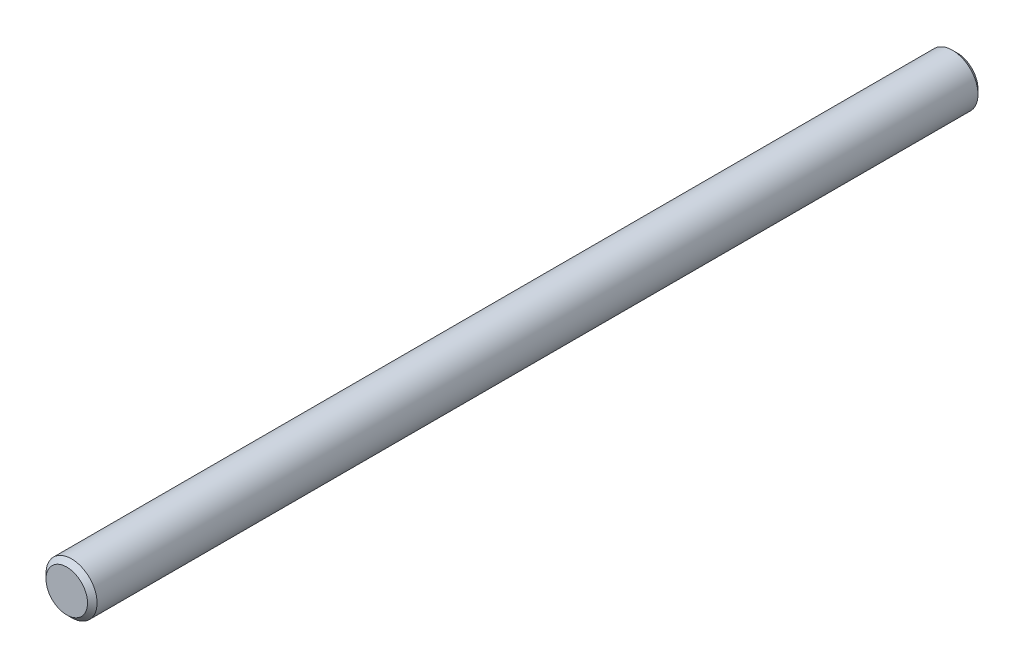
ISO-10303-21;
HEADER;
FILE_DESCRIPTION(('STEP AP214'),'2;1');
FILE_NAME('part.step','',(''),(''),'','','');
FILE_SCHEMA(('AUTOMOTIVE_DESIGN { 1 0 10303 214 1 1 1 1 }'));
ENDSEC;
DATA;
#1=APPLICATION_CONTEXT('core data for automotive mechanical design processes');
#2=APPLICATION_PROTOCOL_DEFINITION('international standard','automotive_design',2000,#1);
#3=PRODUCT_CONTEXT('',#1,'mechanical');
#4=PRODUCT('Part','Part','',(#3));
#5=PRODUCT_RELATED_PRODUCT_CATEGORY('part','',(#4));
#6=PRODUCT_DEFINITION_FORMATION('','',#4);
#7=PRODUCT_DEFINITION_CONTEXT('part definition',#1,'design');
#8=PRODUCT_DEFINITION('design','',#6,#7);
#9=PRODUCT_DEFINITION_SHAPE('','',#8);
#10=(LENGTH_UNIT() NAMED_UNIT(*) SI_UNIT(.MILLI.,.METRE.));
#11=(NAMED_UNIT(*) PLANE_ANGLE_UNIT() SI_UNIT($,.RADIAN.));
#12=(NAMED_UNIT(*) SI_UNIT($,.STERADIAN.) SOLID_ANGLE_UNIT());
#13=UNCERTAINTY_MEASURE_WITH_UNIT(LENGTH_MEASURE(1.E-05),#10,'distance_accuracy_value','');
#14=(GEOMETRIC_REPRESENTATION_CONTEXT(3) GLOBAL_UNCERTAINTY_ASSIGNED_CONTEXT((#13)) GLOBAL_UNIT_ASSIGNED_CONTEXT((#10,
#11,#12)) REPRESENTATION_CONTEXT('',''));
#15=CARTESIAN_POINT('',(0.,0.,0.));
#16=DIRECTION('',(0.,0.,1.));
#17=DIRECTION('',(1.,0.,0.));
#18=AXIS2_PLACEMENT_3D('',#15,#16,#17);
#19=CARTESIAN_POINT('',(0.,0.,-38.1));
#20=DIRECTION('',(0.,0.,1.));
#21=DIRECTION('',(1.,0.,0.));
#22=AXIS2_PLACEMENT_3D('',#19,#20,#21);
#23=CYLINDRICAL_SURFACE('',#22,1.0922);
#24=CARTESIAN_POINT('',(0.,0.,-37.8968));
#25=DIRECTION('',(0.,0.,1.));
#26=DIRECTION('',(1.,0.,0.));
#27=AXIS2_PLACEMENT_3D('',#24,#25,#26);
#28=CIRCLE('',#27,1.0922);
#29=CARTESIAN_POINT('',(1.0922,0.,-37.8968));
#30=VERTEX_POINT('',#29);
#31=EDGE_CURVE('E44',#30,#30,#28,.T.);
#32=CARTESIAN_POINT('',(0.,0.,-0.203199999999994));
#33=DIRECTION('',(0.,0.,1.));
#34=DIRECTION('',(1.,0.,0.));
#35=AXIS2_PLACEMENT_3D('',#32,#33,#34);
#36=CIRCLE('',#35,1.0922);
#37=CARTESIAN_POINT('',(1.0922,0.,-0.203200000000001));
#38=VERTEX_POINT('',#37);
#39=EDGE_CURVE('E48',#38,#38,#36,.F.);
#40=CARTESIAN_POINT('',(1.0922,0.,-37.8968));
#41=CARTESIAN_POINT('',(1.0922,0.,-37.5041583333333));
#42=CARTESIAN_POINT('',(1.0922,0.,-37.1115166666667));
#43=CARTESIAN_POINT('',(1.0922,0.,-36.3262333333333));
#44=CARTESIAN_POINT('',(1.0922,0.,-35.9335916666667));
#45=CARTESIAN_POINT('',(1.0922,0.,-35.1483083333333));
#46=CARTESIAN_POINT('',(1.0922,0.,-34.7556666666667));
#47=CARTESIAN_POINT('',(1.0922,0.,-33.9703833333333));
#48=CARTESIAN_POINT('',(1.0922,0.,-33.5777416666667));
#49=CARTESIAN_POINT('',(1.0922,0.,-32.7924583333333));
#50=CARTESIAN_POINT('',(1.0922,0.,-32.3998166666667));
#51=CARTESIAN_POINT('',(1.0922,0.,-31.6145333333333));
#52=CARTESIAN_POINT('',(1.0922,0.,-31.2218916666667));
#53=CARTESIAN_POINT('',(1.0922,0.,-30.4366083333333));
#54=CARTESIAN_POINT('',(1.0922,0.,-30.0439666666667));
#55=CARTESIAN_POINT('',(1.0922,0.,-29.2586833333333));
#56=CARTESIAN_POINT('',(1.0922,0.,-28.8660416666667));
#57=CARTESIAN_POINT('',(1.0922,0.,-28.0807583333333));
#58=CARTESIAN_POINT('',(1.0922,0.,-27.6881166666667));
#59=CARTESIAN_POINT('',(1.0922,0.,-26.9028333333333));
#60=CARTESIAN_POINT('',(1.0922,0.,-26.5101916666667));
#61=CARTESIAN_POINT('',(1.0922,0.,-25.7249083333333));
#62=CARTESIAN_POINT('',(1.0922,0.,-25.3322666666667));
#63=CARTESIAN_POINT('',(1.0922,0.,-24.5469833333333));
#64=CARTESIAN_POINT('',(1.0922,0.,-24.1543416666667));
#65=CARTESIAN_POINT('',(1.0922,0.,-23.3690583333333));
#66=CARTESIAN_POINT('',(1.0922,0.,-22.9764166666667));
#67=CARTESIAN_POINT('',(1.0922,0.,-22.1911333333333));
#68=CARTESIAN_POINT('',(1.0922,0.,-21.7984916666667));
#69=CARTESIAN_POINT('',(1.0922,0.,-21.0132083333333));
#70=CARTESIAN_POINT('',(1.0922,0.,-20.6205666666667));
#71=CARTESIAN_POINT('',(1.0922,0.,-19.8352833333333));
#72=CARTESIAN_POINT('',(1.0922,0.,-19.4426416666667));
#73=CARTESIAN_POINT('',(1.0922,0.,-18.6573583333333));
#74=CARTESIAN_POINT('',(1.0922,0.,-18.2647166666667));
#75=CARTESIAN_POINT('',(1.0922,0.,-17.4794333333333));
#76=CARTESIAN_POINT('',(1.0922,0.,-17.0867916666667));
#77=CARTESIAN_POINT('',(1.0922,0.,-16.3015083333333));
#78=CARTESIAN_POINT('',(1.0922,0.,-15.9088666666667));
#79=CARTESIAN_POINT('',(1.0922,0.,-15.1235833333333));
#80=CARTESIAN_POINT('',(1.0922,0.,-14.7309416666667));
#81=CARTESIAN_POINT('',(1.0922,0.,-13.9456583333333));
#82=CARTESIAN_POINT('',(1.0922,0.,-13.5530166666667));
#83=CARTESIAN_POINT('',(1.0922,0.,-12.7677333333333));
#84=CARTESIAN_POINT('',(1.0922,0.,-12.3750916666667));
#85=CARTESIAN_POINT('',(1.0922,0.,-11.5898083333333));
#86=CARTESIAN_POINT('',(1.0922,0.,-11.1971666666667));
#87=CARTESIAN_POINT('',(1.0922,0.,-10.4118833333333));
#88=CARTESIAN_POINT('',(1.0922,0.,-10.0192416666667));
#89=CARTESIAN_POINT('',(1.0922,0.,-9.23395833333333));
#90=CARTESIAN_POINT('',(1.0922,0.,-8.84131666666666));
#91=CARTESIAN_POINT('',(1.0922,0.,-8.05603333333333));
#92=CARTESIAN_POINT('',(1.0922,0.,-7.66339166666666));
#93=CARTESIAN_POINT('',(1.0922,0.,-6.87810833333333));
#94=CARTESIAN_POINT('',(1.0922,0.,-6.48546666666666));
#95=CARTESIAN_POINT('',(1.0922,0.,-5.70018333333333));
#96=CARTESIAN_POINT('',(1.0922,0.,-5.30754166666667));
#97=CARTESIAN_POINT('',(1.0922,0.,-4.52225833333333));
#98=CARTESIAN_POINT('',(1.0922,0.,-4.12961666666667));
#99=CARTESIAN_POINT('',(1.0922,0.,-3.34433333333333));
#100=CARTESIAN_POINT('',(1.0922,0.,-2.95169166666666));
#101=CARTESIAN_POINT('',(1.0922,0.,-2.16640833333333));
#102=CARTESIAN_POINT('',(1.0922,0.,-1.77376666666666));
#103=CARTESIAN_POINT('',(1.0922,0.,-0.988483333333331));
#104=CARTESIAN_POINT('',(1.0922,0.,-0.595841666666666));
#105=CARTESIAN_POINT('',(1.0922,0.,-0.203200000000001));
#106=B_SPLINE_CURVE_WITH_KNOTS('',3,(#40,#41,#42,#43,#44,#45,#46,#47,#48,#49,#50,#51,#52,#53,
#54,#55,#56,#57,#58,#59,#60,#61,#62,#63,#64,#65,#66,#67,#68,#69,#70,#71,#72,#73,#74,#75,#76,#77,
#78,#79,#80,#81,#82,#83,#84,#85,#86,#87,#88,#89,#90,#91,#92,#93,#94,#95,#96,#97,#98,#99,#100,
#101,#102,#103,#104,#105),.UNSPECIFIED.,.F.,.F.,(4,2,2,2,2,2,2,2,2,2,2,2,2,2,2,2,2,2,2,2,2,2,2,
2,2,2,2,2,2,2,2,2,4),(0.,1.177925,2.35585000000001,3.533775,4.71170000000001,5.889625,
7.06755000000001,8.245475,9.42340000000001,10.601325,11.77925,12.957175,14.1351,15.313025,
16.49095,17.668875,18.8468,20.024725,21.20265,22.380575,23.5585,24.736425,25.91435,27.092275,
28.2702,29.448125,30.62605,31.803975,32.9819,34.159825,35.33775,36.515675,37.6936),.UNSPECIFIED.);
#107=EDGE_CURVE('BSEAM34',#30,#38,#106,.T.);
#108=ORIENTED_EDGE('',*,*,#31,.T.);
#109=ORIENTED_EDGE('',*,*,#39,.T.);
#110=ORIENTED_EDGE('',*,*,#107,.T.);
#111=ORIENTED_EDGE('',*,*,#107,.F.);
#112=EDGE_LOOP('',(#108,#110,#109,#111));
#113=FACE_BOUND('',#112,.T.);
#114=ADVANCED_FACE('F34',(#113),#23,.T.);
#115=CARTESIAN_POINT('',(0.,0.,-38.1));
#116=DIRECTION('',(0.,0.,1.));
#117=DIRECTION('',(1.,0.,0.));
#118=AXIS2_PLACEMENT_3D('',#115,#116,#117);
#119=PLANE('',#118);
#120=CARTESIAN_POINT('',(0.,0.,-38.1));
#121=DIRECTION('',(0.,0.,1.));
#122=DIRECTION('',(1.,0.,0.));
#123=AXIS2_PLACEMENT_3D('',#120,#121,#122);
#124=CIRCLE('',#123,0.888999999999987);
#125=CARTESIAN_POINT('',(0.888999999999983,0.,-38.1));
#126=VERTEX_POINT('',#125);
#127=EDGE_CURVE('E40',#126,#126,#124,.F.);
#128=ORIENTED_EDGE('',*,*,#127,.T.);
#129=EDGE_LOOP('',(#128));
#130=FACE_BOUND('',#129,.T.);
#131=ADVANCED_FACE('F67',(#130),#119,.F.);
#132=CARTESIAN_POINT('',(0.,0.,0.));
#133=DIRECTION('',(0.,0.,1.));
#134=DIRECTION('',(1.,0.,0.));
#135=AXIS2_PLACEMENT_3D('',#132,#133,#134);
#136=PLANE('',#135);
#137=CARTESIAN_POINT('',(0.,0.,0.));
#138=DIRECTION('',(0.,0.,1.));
#139=DIRECTION('',(1.,0.,0.));
#140=AXIS2_PLACEMENT_3D('',#137,#138,#139);
#141=CIRCLE('',#140,0.889000000000001);
#142=CARTESIAN_POINT('',(0.889000000000001,0.,0.));
#143=VERTEX_POINT('',#142);
#144=EDGE_CURVE('E10',#143,#143,#141,.T.);
#145=ORIENTED_EDGE('',*,*,#144,.T.);
#146=EDGE_LOOP('',(#145));
#147=FACE_BOUND('',#146,.T.);
#148=ADVANCED_FACE('F63',(#147),#136,.T.);
#149=CARTESIAN_POINT('',(0.,0.,-37.8968));
#150=DIRECTION('',(0.,0.,1.));
#151=DIRECTION('',(1.,0.,0.));
#152=AXIS2_PLACEMENT_3D('',#149,#150,#151);
#153=CONICAL_SURFACE('',#152,1.0922,0.785398163397462);
#154=CARTESIAN_POINT('',(0.888999999999983,0.,-38.1));
#155=CARTESIAN_POINT('',(0.891116666666651,0.,-38.0978833333333));
#156=CARTESIAN_POINT('',(0.893233333333318,0.,-38.0957666666667));
#157=CARTESIAN_POINT('',(0.897466666666651,0.,-38.0915333333333));
#158=CARTESIAN_POINT('',(0.899583333333318,0.,-38.0894166666667));
#159=CARTESIAN_POINT('',(0.903816666666651,0.,-38.0851833333333));
#160=CARTESIAN_POINT('',(0.905933333333317,0.,-38.0830666666667));
#161=CARTESIAN_POINT('',(0.910166666666651,0.,-38.0788333333333));
#162=CARTESIAN_POINT('',(0.912283333333319,0.,-38.0767166666667));
#163=CARTESIAN_POINT('',(0.916516666666652,0.,-38.0724833333333));
#164=CARTESIAN_POINT('',(0.918633333333319,0.,-38.0703666666667));
#165=CARTESIAN_POINT('',(0.922866666666652,0.,-38.0661333333333));
#166=CARTESIAN_POINT('',(0.924983333333319,0.,-38.0640166666667));
#167=CARTESIAN_POINT('',(0.929216666666652,0.,-38.0597833333333));
#168=CARTESIAN_POINT('',(0.931333333333319,0.,-38.0576666666667));
#169=CARTESIAN_POINT('',(0.935566666666653,0.,-38.0534333333333));
#170=CARTESIAN_POINT('',(0.93768333333332,0.,-38.0513166666667));
#171=CARTESIAN_POINT('',(0.941916666666654,0.,-38.0470833333333));
#172=CARTESIAN_POINT('',(0.944033333333321,0.,-38.0449666666667));
#173=CARTESIAN_POINT('',(0.948266666666653,0.,-38.0407333333333));
#174=CARTESIAN_POINT('',(0.95038333333332,0.,-38.0386166666667));
#175=CARTESIAN_POINT('',(0.954616666666654,0.,-38.0343833333333));
#176=CARTESIAN_POINT('',(0.956733333333322,0.,-38.0322666666667));
#177=CARTESIAN_POINT('',(0.960966666666655,0.,-38.0280333333333));
#178=CARTESIAN_POINT('',(0.963083333333322,0.,-38.0259166666667));
#179=CARTESIAN_POINT('',(0.967316666666655,0.,-38.0216833333333));
#180=CARTESIAN_POINT('',(0.969433333333322,0.,-38.0195666666667));
#181=CARTESIAN_POINT('',(0.973666666666655,0.,-38.0153333333333));
#182=CARTESIAN_POINT('',(0.975783333333321,0.,-38.0132166666667));
#183=CARTESIAN_POINT('',(0.980016666666655,0.,-38.0089833333333));
#184=CARTESIAN_POINT('',(0.982133333333323,0.,-38.0068666666667));
#185=CARTESIAN_POINT('',(0.986366666666657,0.,-38.0026333333333));
#186=CARTESIAN_POINT('',(0.988483333333323,0.,-38.0005166666667));
#187=CARTESIAN_POINT('',(0.992716666666656,0.,-37.9962833333333));
#188=CARTESIAN_POINT('',(0.994833333333323,0.,-37.9941666666667));
#189=CARTESIAN_POINT('',(0.999066666666657,0.,-37.9899333333333));
#190=CARTESIAN_POINT('',(1.00118333333332,0.,-37.9878166666667));
#191=CARTESIAN_POINT('',(1.00541666666666,0.,-37.9835833333333));
#192=CARTESIAN_POINT('',(1.00753333333332,0.,-37.9814666666667));
#193=CARTESIAN_POINT('',(1.01176666666666,0.,-37.9772333333333));
#194=CARTESIAN_POINT('',(1.01388333333332,0.,-37.9751166666667));
#195=CARTESIAN_POINT('',(1.01811666666666,0.,-37.9708833333333));
#196=CARTESIAN_POINT('',(1.02023333333332,0.,-37.9687666666667));
#197=CARTESIAN_POINT('',(1.02446666666666,0.,-37.9645333333333));
#198=CARTESIAN_POINT('',(1.02658333333333,0.,-37.9624166666667));
#199=CARTESIAN_POINT('',(1.03081666666666,0.,-37.9581833333333));
#200=CARTESIAN_POINT('',(1.03293333333333,0.,-37.9560666666667));
#201=CARTESIAN_POINT('',(1.03716666666666,0.,-37.9518333333333));
#202=CARTESIAN_POINT('',(1.03928333333333,0.,-37.9497166666667));
#203=CARTESIAN_POINT('',(1.04351666666666,0.,-37.9454833333333));
#204=CARTESIAN_POINT('',(1.04563333333333,0.,-37.9433666666667));
#205=CARTESIAN_POINT('',(1.04986666666666,0.,-37.9391333333333));
#206=CARTESIAN_POINT('',(1.05198333333333,0.,-37.9370166666667));
#207=CARTESIAN_POINT('',(1.05621666666666,0.,-37.9327833333333));
#208=CARTESIAN_POINT('',(1.05833333333333,0.,-37.9306666666667));
#209=CARTESIAN_POINT('',(1.06256666666666,0.,-37.9264333333333));
#210=CARTESIAN_POINT('',(1.06468333333333,0.,-37.9243166666667));
#211=CARTESIAN_POINT('',(1.06891666666666,0.,-37.9200833333333));
#212=CARTESIAN_POINT('',(1.07103333333333,0.,-37.9179666666667));
#213=CARTESIAN_POINT('',(1.07526666666666,0.,-37.9137333333333));
#214=CARTESIAN_POINT('',(1.07738333333333,0.,-37.9116166666667));
#215=CARTESIAN_POINT('',(1.08161666666666,0.,-37.9073833333333));
#216=CARTESIAN_POINT('',(1.08373333333333,0.,-37.9052666666667));
#217=CARTESIAN_POINT('',(1.08796666666666,0.,-37.9010333333333));
#218=CARTESIAN_POINT('',(1.09008333333333,0.,-37.8989166666667));
#219=CARTESIAN_POINT('',(1.0922,0.,-37.8968));
#220=B_SPLINE_CURVE_WITH_KNOTS('',3,(#154,#155,#156,#157,#158,#159,#160,#161,#162,#163,#164,
#165,#166,#167,#168,#169,#170,#171,#172,#173,#174,#175,#176,#177,#178,#179,#180,#181,#182,#183,
#184,#185,#186,#187,#188,#189,#190,#191,#192,#193,#194,#195,#196,#197,#198,#199,#200,#201,#202,
#203,#204,#205,#206,#207,#208,#209,#210,#211,#212,#213,#214,#215,#216,#217,#218,#219),
.UNSPECIFIED.,.F.,.F.,(4,2,2,2,2,2,2,2,2,2,2,2,2,2,2,2,2,2,2,2,2,2,2,2,2,2,2,2,2,2,2,2,4),(0.,
0.00898025612106611,0.0179605122421371,0.0269407683632081,0.0359210244842741,0.0449012806053451,
0.0538815367264162,0.0628617928474871,0.0718420489685532,0.0808223050896241,0.0898025612106952,
0.0987828173317613,0.107763073452832,0.116743329573903,0.125723585694974,0.13470384181604,
0.143684097937111,0.152664354058182,0.161644610179248,0.170624866300319,0.17960512242139,
0.188585378542461,0.197565634663527,0.206545890784599,0.215526146905669,0.224506403026735,
0.233486659147807,0.242466915268878,0.251447171389949,0.260427427511015,0.269407683632086,
0.278387939753157,0.287368195874228),.UNSPECIFIED.);
#221=EDGE_CURVE('BSEAM58',#126,#30,#220,.T.);
#222=ORIENTED_EDGE('',*,*,#127,.F.);
#223=ORIENTED_EDGE('',*,*,#31,.F.);
#224=ORIENTED_EDGE('',*,*,#221,.T.);
#225=ORIENTED_EDGE('',*,*,#221,.F.);
#226=EDGE_LOOP('',(#222,#224,#223,#225));
#227=FACE_BOUND('',#226,.T.);
#228=ADVANCED_FACE('F58',(#227),#153,.T.);
#229=CARTESIAN_POINT('',(0.,0.,0.));
#230=DIRECTION('',(0.,0.,-1.));
#231=DIRECTION('',(-1.,0.,0.));
#232=AXIS2_PLACEMENT_3D('',#229,#230,#231);
#233=CONICAL_SURFACE('',#232,0.889000000000001,0.785398163397462);
#234=ORIENTED_EDGE('',*,*,#39,.F.);
#235=EDGE_LOOP('',(#234));
#236=FACE_BOUND('',#235,.T.);
#237=ORIENTED_EDGE('',*,*,#144,.F.);
#238=EDGE_LOOP('',(#237));
#239=FACE_BOUND('',#238,.T.);
#240=ADVANCED_FACE('F55',(#236,#239),#233,.T.);
#241=CLOSED_SHELL('',(#114,#131,#148,#228,#240));
#242=MANIFOLD_SOLID_BREP('B2',#241);
#243=ADVANCED_BREP_SHAPE_REPRESENTATION('',(#18,#242),#14);
#244=SHAPE_DEFINITION_REPRESENTATION(#9,#243);
ENDSEC;
END-ISO-10303-21;
